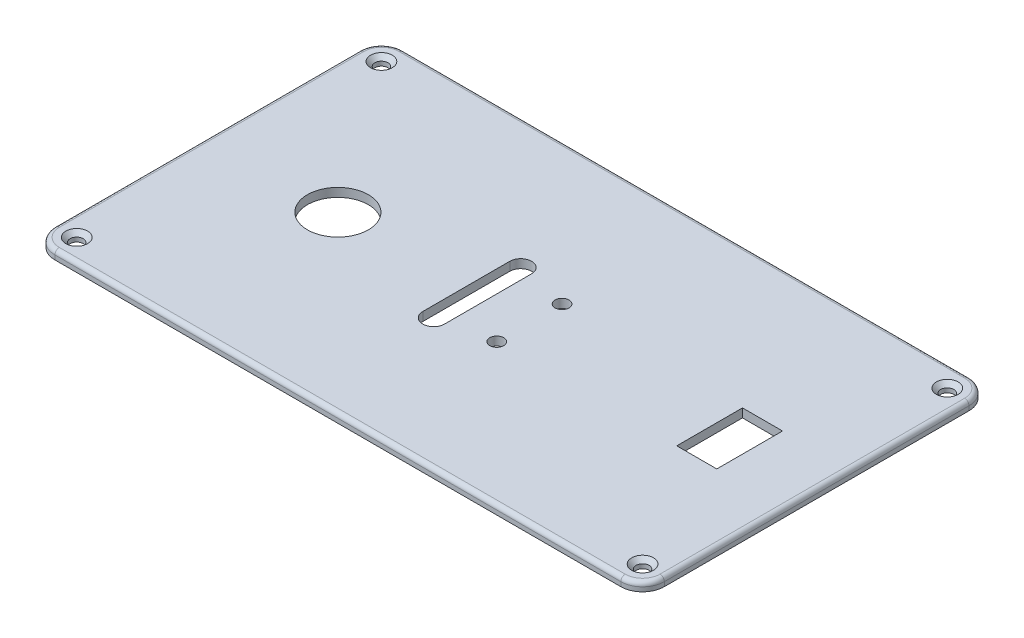
ISO-10303-21;
HEADER;
FILE_DESCRIPTION(('STEP AP214'),'2;1');
FILE_NAME('part.step','',(''),(''),'','','');
FILE_SCHEMA(('AUTOMOTIVE_DESIGN { 1 0 10303 214 1 1 1 1 }'));
ENDSEC;
DATA;
#1=APPLICATION_CONTEXT('core data for automotive mechanical design processes');
#2=APPLICATION_PROTOCOL_DEFINITION('international standard','automotive_design',2000,#1);
#3=PRODUCT_CONTEXT('',#1,'mechanical');
#4=PRODUCT('Part','Part','',(#3));
#5=PRODUCT_RELATED_PRODUCT_CATEGORY('part','',(#4));
#6=PRODUCT_DEFINITION_FORMATION('','',#4);
#7=PRODUCT_DEFINITION_CONTEXT('part definition',#1,'design');
#8=PRODUCT_DEFINITION('design','',#6,#7);
#9=PRODUCT_DEFINITION_SHAPE('','',#8);
#10=(LENGTH_UNIT() NAMED_UNIT(*) SI_UNIT(.MILLI.,.METRE.));
#11=(NAMED_UNIT(*) PLANE_ANGLE_UNIT() SI_UNIT($,.RADIAN.));
#12=(NAMED_UNIT(*) SI_UNIT($,.STERADIAN.) SOLID_ANGLE_UNIT());
#13=UNCERTAINTY_MEASURE_WITH_UNIT(LENGTH_MEASURE(1.E-05),#10,'distance_accuracy_value','');
#14=(GEOMETRIC_REPRESENTATION_CONTEXT(3) GLOBAL_UNCERTAINTY_ASSIGNED_CONTEXT((#13)) GLOBAL_UNIT_ASSIGNED_CONTEXT((#10,
#11,#12)) REPRESENTATION_CONTEXT('',''));
#15=CARTESIAN_POINT('',(0.,0.,0.));
#16=DIRECTION('',(0.,0.,1.));
#17=DIRECTION('',(1.,0.,0.));
#18=AXIS2_PLACEMENT_3D('',#15,#16,#17);
#19=CARTESIAN_POINT('',(-65.,2.,35.));
#20=DIRECTION('',(0.,-1.,0.));
#21=DIRECTION('',(0.,0.,-1.));
#22=AXIS2_PLACEMENT_3D('',#19,#20,#21);
#23=CYLINDRICAL_SURFACE('',#22,5.);
#24=DIRECTION('',(0.,-1.,0.));
#25=VECTOR('',#24,1.);
#26=CARTESIAN_POINT('',(-65.,2.,40.));
#27=LINE('',#26,#25);
#28=CARTESIAN_POINT('',(-65.,1.,40.));
#29=VERTEX_POINT('',#28);
#30=CARTESIAN_POINT('',(-65.,0.,40.));
#31=VERTEX_POINT('',#30);
#32=EDGE_CURVE('E326',#29,#31,#27,.T.);
#33=ORIENTED_EDGE('',*,*,#32,.F.);
#34=CARTESIAN_POINT('',(-65.,1.,35.));
#35=DIRECTION('',(0.,-1.,0.));
#36=DIRECTION('',(0.,0.,-1.));
#37=AXIS2_PLACEMENT_3D('',#34,#35,#36);
#38=CIRCLE('',#37,5.);
#39=CARTESIAN_POINT('',(-70.,1.,35.));
#40=VERTEX_POINT('',#39);
#41=EDGE_CURVE('E374',#29,#40,#38,.T.);
#42=ORIENTED_EDGE('',*,*,#41,.T.);
#43=DIRECTION('',(0.,-1.,0.));
#44=VECTOR('',#43,1.);
#45=CARTESIAN_POINT('',(-70.,2.,35.));
#46=LINE('',#45,#44);
#47=CARTESIAN_POINT('',(-70.,0.,35.));
#48=VERTEX_POINT('',#47);
#49=EDGE_CURVE('E312',#40,#48,#46,.T.);
#50=ORIENTED_EDGE('',*,*,#49,.T.);
#51=CARTESIAN_POINT('',(-65.,0.,35.));
#52=DIRECTION('',(0.,1.,0.));
#53=DIRECTION('',(0.,0.,-1.));
#54=AXIS2_PLACEMENT_3D('',#51,#52,#53);
#55=CIRCLE('',#54,5.);
#56=EDGE_CURVE('E288',#48,#31,#55,.T.);
#57=ORIENTED_EDGE('',*,*,#56,.T.);
#58=EDGE_LOOP('',(#33,#42,#50,#57));
#59=FACE_BOUND('',#58,.T.);
#60=ADVANCED_FACE('F45',(#59),#23,.T.);
#61=CARTESIAN_POINT('',(-65.,2.,40.));
#62=DIRECTION('',(0.,0.,-1.));
#63=DIRECTION('',(-1.,0.,0.));
#64=AXIS2_PLACEMENT_3D('',#61,#62,#63);
#65=PLANE('',#64);
#66=DIRECTION('',(0.,-1.,0.));
#67=VECTOR('',#66,1.);
#68=CARTESIAN_POINT('',(65.,2.,40.));
#69=LINE('',#68,#67);
#70=CARTESIAN_POINT('',(65.,1.,40.));
#71=VERTEX_POINT('',#70);
#72=CARTESIAN_POINT('',(65.,0.,40.));
#73=VERTEX_POINT('',#72);
#74=EDGE_CURVE('E324',#71,#73,#69,.T.);
#75=ORIENTED_EDGE('',*,*,#74,.F.);
#76=DIRECTION('',(1.,0.,0.));
#77=VECTOR('',#76,1.);
#78=CARTESIAN_POINT('',(-65.,1.,40.));
#79=LINE('',#78,#77);
#80=EDGE_CURVE('E372',#71,#29,#79,.F.);
#81=ORIENTED_EDGE('',*,*,#80,.T.);
#82=ORIENTED_EDGE('',*,*,#32,.T.);
#83=DIRECTION('',(1.,0.,0.));
#84=VECTOR('',#83,1.);
#85=CARTESIAN_POINT('',(-65.,0.,40.));
#86=LINE('',#85,#84);
#87=EDGE_CURVE('E291',#31,#73,#86,.T.);
#88=ORIENTED_EDGE('',*,*,#87,.T.);
#89=EDGE_LOOP('',(#75,#81,#82,#88));
#90=FACE_BOUND('',#89,.T.);
#91=ADVANCED_FACE('F472',(#90),#65,.F.);
#92=CARTESIAN_POINT('',(65.,2.,35.));
#93=DIRECTION('',(0.,-1.,0.));
#94=DIRECTION('',(0.,0.,-1.));
#95=AXIS2_PLACEMENT_3D('',#92,#93,#94);
#96=CYLINDRICAL_SURFACE('',#95,5.);
#97=DIRECTION('',(0.,-1.,0.));
#98=VECTOR('',#97,1.);
#99=CARTESIAN_POINT('',(70.,2.,35.));
#100=LINE('',#99,#98);
#101=CARTESIAN_POINT('',(70.,1.,35.));
#102=VERTEX_POINT('',#101);
#103=CARTESIAN_POINT('',(70.,0.,35.));
#104=VERTEX_POINT('',#103);
#105=EDGE_CURVE('E322',#102,#104,#100,.T.);
#106=ORIENTED_EDGE('',*,*,#105,.F.);
#107=CARTESIAN_POINT('',(65.,1.,35.));
#108=DIRECTION('',(0.,-1.,0.));
#109=DIRECTION('',(0.,0.,-1.));
#110=AXIS2_PLACEMENT_3D('',#107,#108,#109);
#111=CIRCLE('',#110,5.);
#112=EDGE_CURVE('E369',#102,#71,#111,.T.);
#113=ORIENTED_EDGE('',*,*,#112,.T.);
#114=ORIENTED_EDGE('',*,*,#74,.T.);
#115=CARTESIAN_POINT('',(65.,0.,35.));
#116=DIRECTION('',(0.,1.,0.));
#117=DIRECTION('',(0.,0.,1.));
#118=AXIS2_PLACEMENT_3D('',#115,#116,#117);
#119=CIRCLE('',#118,5.);
#120=EDGE_CURVE('E294',#73,#104,#119,.T.);
#121=ORIENTED_EDGE('',*,*,#120,.T.);
#122=EDGE_LOOP('',(#106,#113,#114,#121));
#123=FACE_BOUND('',#122,.T.);
#124=ADVANCED_FACE('F458',(#123),#96,.T.);
#125=CARTESIAN_POINT('',(70.,2.,35.));
#126=DIRECTION('',(-1.,0.,0.));
#127=DIRECTION('',(0.,0.,1.));
#128=AXIS2_PLACEMENT_3D('',#125,#126,#127);
#129=PLANE('',#128);
#130=DIRECTION('',(0.,-1.,0.));
#131=VECTOR('',#130,1.);
#132=CARTESIAN_POINT('',(70.,2.,-35.));
#133=LINE('',#132,#131);
#134=CARTESIAN_POINT('',(70.,1.,-35.));
#135=VERTEX_POINT('',#134);
#136=CARTESIAN_POINT('',(70.,0.,-35.));
#137=VERTEX_POINT('',#136);
#138=EDGE_CURVE('E320',#135,#137,#133,.T.);
#139=ORIENTED_EDGE('',*,*,#138,.F.);
#140=DIRECTION('',(0.,0.,-1.));
#141=VECTOR('',#140,1.);
#142=CARTESIAN_POINT('',(70.,1.,35.));
#143=LINE('',#142,#141);
#144=EDGE_CURVE('E11',#135,#102,#143,.F.);
#145=ORIENTED_EDGE('',*,*,#144,.T.);
#146=ORIENTED_EDGE('',*,*,#105,.T.);
#147=DIRECTION('',(0.,0.,-1.));
#148=VECTOR('',#147,1.);
#149=CARTESIAN_POINT('',(70.,0.,35.));
#150=LINE('',#149,#148);
#151=EDGE_CURVE('E297',#104,#137,#150,.T.);
#152=ORIENTED_EDGE('',*,*,#151,.T.);
#153=EDGE_LOOP('',(#139,#145,#146,#152));
#154=FACE_BOUND('',#153,.T.);
#155=ADVANCED_FACE('F455',(#154),#129,.F.);
#156=CARTESIAN_POINT('',(65.,2.,-35.));
#157=DIRECTION('',(0.,-1.,0.));
#158=DIRECTION('',(0.,0.,-1.));
#159=AXIS2_PLACEMENT_3D('',#156,#157,#158);
#160=CYLINDRICAL_SURFACE('',#159,5.);
#161=DIRECTION('',(0.,-1.,0.));
#162=VECTOR('',#161,1.);
#163=CARTESIAN_POINT('',(65.,2.,-40.));
#164=LINE('',#163,#162);
#165=CARTESIAN_POINT('',(65.,1.,-40.));
#166=VERTEX_POINT('',#165);
#167=CARTESIAN_POINT('',(65.,0.,-40.));
#168=VERTEX_POINT('',#167);
#169=EDGE_CURVE('E318',#166,#168,#164,.T.);
#170=ORIENTED_EDGE('',*,*,#169,.F.);
#171=CARTESIAN_POINT('',(65.,1.,-35.));
#172=DIRECTION('',(0.,-1.,0.));
#173=DIRECTION('',(0.,0.,-1.));
#174=AXIS2_PLACEMENT_3D('',#171,#172,#173);
#175=CIRCLE('',#174,5.);
#176=EDGE_CURVE('E54',#166,#135,#175,.T.);
#177=ORIENTED_EDGE('',*,*,#176,.T.);
#178=ORIENTED_EDGE('',*,*,#138,.T.);
#179=CARTESIAN_POINT('',(65.,0.,-35.));
#180=DIRECTION('',(0.,1.,0.));
#181=DIRECTION('',(0.,0.,-1.));
#182=AXIS2_PLACEMENT_3D('',#179,#180,#181);
#183=CIRCLE('',#182,5.);
#184=EDGE_CURVE('E300',#137,#168,#183,.T.);
#185=ORIENTED_EDGE('',*,*,#184,.T.);
#186=EDGE_LOOP('',(#170,#177,#178,#185));
#187=FACE_BOUND('',#186,.T.);
#188=ADVANCED_FACE('F554',(#187),#160,.T.);
#189=CARTESIAN_POINT('',(-65.,2.,-40.));
#190=DIRECTION('',(0.,0.,1.));
#191=DIRECTION('',(1.,0.,0.));
#192=AXIS2_PLACEMENT_3D('',#189,#190,#191);
#193=PLANE('',#192);
#194=DIRECTION('',(0.,-1.,0.));
#195=VECTOR('',#194,1.);
#196=CARTESIAN_POINT('',(-65.,2.,-40.));
#197=LINE('',#196,#195);
#198=CARTESIAN_POINT('',(-65.,1.,-40.));
#199=VERTEX_POINT('',#198);
#200=CARTESIAN_POINT('',(-65.,0.,-40.));
#201=VERTEX_POINT('',#200);
#202=EDGE_CURVE('E316',#199,#201,#197,.T.);
#203=ORIENTED_EDGE('',*,*,#202,.F.);
#204=DIRECTION('',(-1.,0.,0.));
#205=VECTOR('',#204,1.);
#206=CARTESIAN_POINT('',(-65.,1.,-40.));
#207=LINE('',#206,#205);
#208=EDGE_CURVE('E69',#199,#166,#207,.F.);
#209=ORIENTED_EDGE('',*,*,#208,.T.);
#210=ORIENTED_EDGE('',*,*,#169,.T.);
#211=DIRECTION('',(-1.,0.,0.));
#212=VECTOR('',#211,1.);
#213=CARTESIAN_POINT('',(-65.,0.,-40.));
#214=LINE('',#213,#212);
#215=EDGE_CURVE('E303',#168,#201,#214,.T.);
#216=ORIENTED_EDGE('',*,*,#215,.T.);
#217=EDGE_LOOP('',(#203,#209,#210,#216));
#218=FACE_BOUND('',#217,.T.);
#219=ADVANCED_FACE('F415',(#218),#193,.F.);
#220=CARTESIAN_POINT('',(-65.,2.,-35.));
#221=DIRECTION('',(0.,-1.,0.));
#222=DIRECTION('',(0.,0.,-1.));
#223=AXIS2_PLACEMENT_3D('',#220,#221,#222);
#224=CYLINDRICAL_SURFACE('',#223,5.);
#225=DIRECTION('',(0.,-1.,0.));
#226=VECTOR('',#225,1.);
#227=CARTESIAN_POINT('',(-70.,2.,-35.));
#228=LINE('',#227,#226);
#229=CARTESIAN_POINT('',(-70.,1.,-35.));
#230=VERTEX_POINT('',#229);
#231=CARTESIAN_POINT('',(-70.,0.,-35.));
#232=VERTEX_POINT('',#231);
#233=EDGE_CURVE('E314',#230,#232,#228,.T.);
#234=ORIENTED_EDGE('',*,*,#233,.F.);
#235=CARTESIAN_POINT('',(-65.,1.,-35.));
#236=DIRECTION('',(0.,-1.,0.));
#237=DIRECTION('',(0.,0.,-1.));
#238=AXIS2_PLACEMENT_3D('',#235,#236,#237);
#239=CIRCLE('',#238,5.);
#240=EDGE_CURVE('E378',#230,#199,#239,.T.);
#241=ORIENTED_EDGE('',*,*,#240,.T.);
#242=ORIENTED_EDGE('',*,*,#202,.T.);
#243=CARTESIAN_POINT('',(-65.,0.,-35.));
#244=DIRECTION('',(0.,1.,0.));
#245=DIRECTION('',(0.,0.,-1.));
#246=AXIS2_PLACEMENT_3D('',#243,#244,#245);
#247=CIRCLE('',#246,5.);
#248=EDGE_CURVE('E306',#201,#232,#247,.T.);
#249=ORIENTED_EDGE('',*,*,#248,.T.);
#250=EDGE_LOOP('',(#234,#241,#242,#249));
#251=FACE_BOUND('',#250,.T.);
#252=ADVANCED_FACE('F414',(#251),#224,.T.);
#253=CARTESIAN_POINT('',(-70.,2.,35.));
#254=DIRECTION('',(1.,0.,0.));
#255=DIRECTION('',(0.,0.,-1.));
#256=AXIS2_PLACEMENT_3D('',#253,#254,#255);
#257=PLANE('',#256);
#258=ORIENTED_EDGE('',*,*,#49,.F.);
#259=DIRECTION('',(0.,0.,1.));
#260=VECTOR('',#259,1.);
#261=CARTESIAN_POINT('',(-70.,1.,35.));
#262=LINE('',#261,#260);
#263=EDGE_CURVE('E376',#40,#230,#262,.F.);
#264=ORIENTED_EDGE('',*,*,#263,.T.);
#265=ORIENTED_EDGE('',*,*,#233,.T.);
#266=DIRECTION('',(0.,0.,1.));
#267=VECTOR('',#266,1.);
#268=CARTESIAN_POINT('',(-70.,0.,35.));
#269=LINE('',#268,#267);
#270=EDGE_CURVE('E309',#232,#48,#269,.T.);
#271=ORIENTED_EDGE('',*,*,#270,.T.);
#272=EDGE_LOOP('',(#258,#264,#265,#271));
#273=FACE_BOUND('',#272,.T.);
#274=ADVANCED_FACE('F425',(#273),#257,.F.);
#275=CARTESIAN_POINT('',(-65.,2.,35.));
#276=DIRECTION('',(0.,-1.,0.));
#277=DIRECTION('',(0.,0.,-1.));
#278=AXIS2_PLACEMENT_3D('',#275,#276,#277);
#279=PLANE('',#278);
#280=DIRECTION('',(1.,0.,0.));
#281=VECTOR('',#280,1.);
#282=CARTESIAN_POINT('',(-65.,2.,39.));
#283=LINE('',#282,#281);
#284=CARTESIAN_POINT('',(-65.,2.,39.));
#285=VERTEX_POINT('',#284);
#286=CARTESIAN_POINT('',(65.,2.,39.));
#287=VERTEX_POINT('',#286);
#288=EDGE_CURVE('E364',#285,#287,#283,.T.);
#289=ORIENTED_EDGE('',*,*,#288,.T.);
#290=CARTESIAN_POINT('',(65.,2.,35.));
#291=DIRECTION('',(0.,-1.,0.));
#292=DIRECTION('',(0.,0.,-1.));
#293=AXIS2_PLACEMENT_3D('',#290,#291,#292);
#294=CIRCLE('',#293,4.);
#295=CARTESIAN_POINT('',(69.,2.,35.));
#296=VERTEX_POINT('',#295);
#297=EDGE_CURVE('E366',#287,#296,#294,.F.);
#298=ORIENTED_EDGE('',*,*,#297,.T.);
#299=DIRECTION('',(0.,0.,-1.));
#300=VECTOR('',#299,1.);
#301=CARTESIAN_POINT('',(69.,2.,35.));
#302=LINE('',#301,#300);
#303=CARTESIAN_POINT('',(69.,2.,-35.));
#304=VERTEX_POINT('',#303);
#305=EDGE_CURVE('E352',#296,#304,#302,.T.);
#306=ORIENTED_EDGE('',*,*,#305,.T.);
#307=CARTESIAN_POINT('',(65.,2.,-35.));
#308=DIRECTION('',(0.,-1.,0.));
#309=DIRECTION('',(0.,0.,-1.));
#310=AXIS2_PLACEMENT_3D('',#307,#308,#309);
#311=CIRCLE('',#310,4.);
#312=CARTESIAN_POINT('',(65.,2.,-39.));
#313=VERTEX_POINT('',#312);
#314=EDGE_CURVE('E354',#304,#313,#311,.F.);
#315=ORIENTED_EDGE('',*,*,#314,.T.);
#316=DIRECTION('',(-1.,0.,0.));
#317=VECTOR('',#316,1.);
#318=CARTESIAN_POINT('',(-65.,2.,-39.));
#319=LINE('',#318,#317);
#320=CARTESIAN_POINT('',(-65.,2.,-39.));
#321=VERTEX_POINT('',#320);
#322=EDGE_CURVE('E356',#313,#321,#319,.T.);
#323=ORIENTED_EDGE('',*,*,#322,.T.);
#324=CARTESIAN_POINT('',(-65.,2.,-35.));
#325=DIRECTION('',(0.,-1.,0.));
#326=DIRECTION('',(0.,0.,-1.));
#327=AXIS2_PLACEMENT_3D('',#324,#325,#326);
#328=CIRCLE('',#327,4.);
#329=CARTESIAN_POINT('',(-69.,2.,-35.));
#330=VERTEX_POINT('',#329);
#331=EDGE_CURVE('E358',#321,#330,#328,.F.);
#332=ORIENTED_EDGE('',*,*,#331,.T.);
#333=DIRECTION('',(0.,0.,1.));
#334=VECTOR('',#333,1.);
#335=CARTESIAN_POINT('',(-69.,2.,35.));
#336=LINE('',#335,#334);
#337=CARTESIAN_POINT('',(-69.,2.,35.));
#338=VERTEX_POINT('',#337);
#339=EDGE_CURVE('E360',#330,#338,#336,.T.);
#340=ORIENTED_EDGE('',*,*,#339,.T.);
#341=CARTESIAN_POINT('',(-65.,2.,35.));
#342=DIRECTION('',(0.,-1.,0.));
#343=DIRECTION('',(0.,0.,-1.));
#344=AXIS2_PLACEMENT_3D('',#341,#342,#343);
#345=CIRCLE('',#344,4.);
#346=EDGE_CURVE('E362',#338,#285,#345,.F.);
#347=ORIENTED_EDGE('',*,*,#346,.T.);
#348=EDGE_LOOP('',(#289,#298,#306,#315,#323,#332,#340,#347));
#349=FACE_BOUND('',#348,.T.);
#350=DIRECTION('',(-1.,0.,0.));
#351=VECTOR('',#350,1.);
#352=CARTESIAN_POINT('',(45.4,2.,-7.54999999999999));
#353=LINE('',#352,#351);
#354=CARTESIAN_POINT('',(54.6,2.,-7.54999999999999));
#355=VERTEX_POINT('',#354);
#356=CARTESIAN_POINT('',(45.4,2.,-7.54999999999999));
#357=VERTEX_POINT('',#356);
#358=EDGE_CURVE('E217',#355,#357,#353,.T.);
#359=ORIENTED_EDGE('',*,*,#358,.F.);
#360=DIRECTION('',(0.,0.,-1.));
#361=VECTOR('',#360,1.);
#362=CARTESIAN_POINT('',(54.6,2.,-7.54999999999999));
#363=LINE('',#362,#361);
#364=CARTESIAN_POINT('',(54.6,2.,7.55000000000001));
#365=VERTEX_POINT('',#364);
#366=EDGE_CURVE('E190',#365,#355,#363,.T.);
#367=ORIENTED_EDGE('',*,*,#366,.F.);
#368=DIRECTION('',(1.,0.,0.));
#369=VECTOR('',#368,1.);
#370=CARTESIAN_POINT('',(45.4,2.,7.55000000000001));
#371=LINE('',#370,#369);
#372=CARTESIAN_POINT('',(45.4,2.,7.55000000000001));
#373=VERTEX_POINT('',#372);
#374=EDGE_CURVE('E208',#373,#365,#371,.T.);
#375=ORIENTED_EDGE('',*,*,#374,.F.);
#376=DIRECTION('',(0.,0.,1.));
#377=VECTOR('',#376,1.);
#378=CARTESIAN_POINT('',(45.4,2.,-7.54999999999999));
#379=LINE('',#378,#377);
#380=EDGE_CURVE('E211',#357,#373,#379,.T.);
#381=ORIENTED_EDGE('',*,*,#380,.F.);
#382=EDGE_LOOP('',(#359,#367,#375,#381));
#383=FACE_BOUND('',#382,.T.);
#384=CARTESIAN_POINT('',(-40.,2.,0.));
#385=DIRECTION('',(0.,1.,0.));
#386=DIRECTION('',(0.,0.,1.));
#387=AXIS2_PLACEMENT_3D('',#384,#385,#386);
#388=CIRCLE('',#387,7.);
#389=CARTESIAN_POINT('',(-40.,2.,7.00000000000001));
#390=VERTEX_POINT('',#389);
#391=EDGE_CURVE('E230',#390,#390,#388,.T.);
#392=ORIENTED_EDGE('',*,*,#391,.F.);
#393=EDGE_LOOP('',(#392));
#394=FACE_BOUND('',#393,.T.);
#395=DIRECTION('',(0.,0.,-1.));
#396=VECTOR('',#395,1.);
#397=CARTESIAN_POINT('',(-5.5,2.,10.));
#398=LINE('',#397,#396);
#399=CARTESIAN_POINT('',(-5.5,2.,10.));
#400=VERTEX_POINT('',#399);
#401=CARTESIAN_POINT('',(-5.5,2.,-10.));
#402=VERTEX_POINT('',#401);
#403=EDGE_CURVE('E256',#400,#402,#398,.T.);
#404=ORIENTED_EDGE('',*,*,#403,.F.);
#405=CARTESIAN_POINT('',(-8.,2.,10.));
#406=DIRECTION('',(0.,1.,0.));
#407=DIRECTION('',(0.,0.,1.));
#408=AXIS2_PLACEMENT_3D('',#405,#406,#407);
#409=CIRCLE('',#408,2.5);
#410=CARTESIAN_POINT('',(-10.5,2.,10.));
#411=VERTEX_POINT('',#410);
#412=EDGE_CURVE('E224',#411,#400,#409,.T.);
#413=ORIENTED_EDGE('',*,*,#412,.F.);
#414=DIRECTION('',(0.,0.,1.));
#415=VECTOR('',#414,1.);
#416=CARTESIAN_POINT('',(-10.5,2.,10.));
#417=LINE('',#416,#415);
#418=CARTESIAN_POINT('',(-10.5,2.,-10.));
#419=VERTEX_POINT('',#418);
#420=EDGE_CURVE('E245',#419,#411,#417,.T.);
#421=ORIENTED_EDGE('',*,*,#420,.F.);
#422=CARTESIAN_POINT('',(-8.,2.,-10.));
#423=DIRECTION('',(0.,1.,0.));
#424=DIRECTION('',(0.,0.,1.));
#425=AXIS2_PLACEMENT_3D('',#422,#423,#424);
#426=CIRCLE('',#425,2.5);
#427=EDGE_CURVE('E259',#402,#419,#426,.T.);
#428=ORIENTED_EDGE('',*,*,#427,.F.);
#429=EDGE_LOOP('',(#404,#413,#421,#428));
#430=FACE_BOUND('',#429,.T.);
#431=CARTESIAN_POINT('',(4.,2.,7.5));
#432=DIRECTION('',(0.,1.,0.));
#433=DIRECTION('',(0.,0.,1.));
#434=AXIS2_PLACEMENT_3D('',#431,#432,#433);
#435=CIRCLE('',#434,1.6);
#436=CARTESIAN_POINT('',(4.,2.,9.1));
#437=VERTEX_POINT('',#436);
#438=EDGE_CURVE('E237',#437,#437,#435,.T.);
#439=ORIENTED_EDGE('',*,*,#438,.F.);
#440=EDGE_LOOP('',(#439));
#441=FACE_BOUND('',#440,.T.);
#442=CARTESIAN_POINT('',(4.,2.,-7.5));
#443=DIRECTION('',(0.,1.,0.));
#444=DIRECTION('',(0.,0.,1.));
#445=AXIS2_PLACEMENT_3D('',#442,#443,#444);
#446=CIRCLE('',#445,1.6);
#447=CARTESIAN_POINT('',(4.,2.,-5.9));
#448=VERTEX_POINT('',#447);
#449=EDGE_CURVE('E236',#448,#448,#446,.T.);
#450=ORIENTED_EDGE('',*,*,#449,.F.);
#451=EDGE_LOOP('',(#450));
#452=FACE_BOUND('',#451,.T.);
#453=CARTESIAN_POINT('',(65.,2.,-35.));
#454=DIRECTION('',(0.,-1.,0.));
#455=DIRECTION('',(0.,0.,-1.));
#456=AXIS2_PLACEMENT_3D('',#453,#454,#455);
#457=CIRCLE('',#456,2.49999999999997);
#458=CARTESIAN_POINT('',(65.,2.,-37.5));
#459=VERTEX_POINT('',#458);
#460=EDGE_CURVE('E340',#459,#459,#457,.T.);
#461=ORIENTED_EDGE('',*,*,#460,.T.);
#462=EDGE_LOOP('',(#461));
#463=FACE_BOUND('',#462,.T.);
#464=CARTESIAN_POINT('',(65.,2.,35.));
#465=DIRECTION('',(0.,-1.,0.));
#466=DIRECTION('',(0.,0.,-1.));
#467=AXIS2_PLACEMENT_3D('',#464,#465,#466);
#468=CIRCLE('',#467,2.49999999999997);
#469=CARTESIAN_POINT('',(65.,2.,32.5));
#470=VERTEX_POINT('',#469);
#471=EDGE_CURVE('E337',#470,#470,#468,.T.);
#472=ORIENTED_EDGE('',*,*,#471,.T.);
#473=EDGE_LOOP('',(#472));
#474=FACE_BOUND('',#473,.T.);
#475=CARTESIAN_POINT('',(-65.,2.,35.));
#476=DIRECTION('',(0.,-1.,0.));
#477=DIRECTION('',(0.,0.,-1.));
#478=AXIS2_PLACEMENT_3D('',#475,#476,#477);
#479=CIRCLE('',#478,2.49999999999997);
#480=CARTESIAN_POINT('',(-65.,2.,32.5));
#481=VERTEX_POINT('',#480);
#482=EDGE_CURVE('E334',#481,#481,#479,.T.);
#483=ORIENTED_EDGE('',*,*,#482,.T.);
#484=EDGE_LOOP('',(#483));
#485=FACE_BOUND('',#484,.T.);
#486=CARTESIAN_POINT('',(-65.,2.,-35.));
#487=DIRECTION('',(0.,-1.,0.));
#488=DIRECTION('',(0.,0.,-1.));
#489=AXIS2_PLACEMENT_3D('',#486,#487,#488);
#490=CIRCLE('',#489,2.49999999999997);
#491=CARTESIAN_POINT('',(-65.,2.,-37.5));
#492=VERTEX_POINT('',#491);
#493=EDGE_CURVE('E331',#492,#492,#490,.T.);
#494=ORIENTED_EDGE('',*,*,#493,.T.);
#495=EDGE_LOOP('',(#494));
#496=FACE_BOUND('',#495,.T.);
#497=ADVANCED_FACE('F440',(#349,#383,#394,#430,#441,#452,#463,#474,#485,#496),#279,.F.);
#498=CARTESIAN_POINT('',(-65.,0.,35.));
#499=DIRECTION('',(0.,-1.,0.));
#500=DIRECTION('',(0.,0.,-1.));
#501=AXIS2_PLACEMENT_3D('',#498,#499,#500);
#502=PLANE('',#501);
#503=DIRECTION('',(0.,0.,-1.));
#504=VECTOR('',#503,1.);
#505=CARTESIAN_POINT('',(54.6,0.,-7.54999999999999));
#506=LINE('',#505,#504);
#507=CARTESIAN_POINT('',(54.6,0.,7.55000000000001));
#508=VERTEX_POINT('',#507);
#509=CARTESIAN_POINT('',(54.6,0.,-7.54999999999999));
#510=VERTEX_POINT('',#509);
#511=EDGE_CURVE('E187',#508,#510,#506,.T.);
#512=ORIENTED_EDGE('',*,*,#511,.T.);
#513=DIRECTION('',(-1.,0.,0.));
#514=VECTOR('',#513,1.);
#515=CARTESIAN_POINT('',(45.4,0.,-7.54999999999999));
#516=LINE('',#515,#514);
#517=CARTESIAN_POINT('',(45.4,0.,-7.54999999999999));
#518=VERTEX_POINT('',#517);
#519=EDGE_CURVE('E199',#510,#518,#516,.T.);
#520=ORIENTED_EDGE('',*,*,#519,.T.);
#521=DIRECTION('',(0.,0.,1.));
#522=VECTOR('',#521,1.);
#523=CARTESIAN_POINT('',(45.4,0.,-7.54999999999999));
#524=LINE('',#523,#522);
#525=CARTESIAN_POINT('',(45.4,0.,7.55000000000001));
#526=VERTEX_POINT('',#525);
#527=EDGE_CURVE('E203',#518,#526,#524,.T.);
#528=ORIENTED_EDGE('',*,*,#527,.T.);
#529=DIRECTION('',(1.,0.,0.));
#530=VECTOR('',#529,1.);
#531=CARTESIAN_POINT('',(45.4,0.,7.55000000000001));
#532=LINE('',#531,#530);
#533=EDGE_CURVE('E195',#526,#508,#532,.T.);
#534=ORIENTED_EDGE('',*,*,#533,.T.);
#535=EDGE_LOOP('',(#512,#520,#528,#534));
#536=FACE_BOUND('',#535,.T.);
#537=CARTESIAN_POINT('',(-40.,0.,0.));
#538=DIRECTION('',(0.,1.,0.));
#539=DIRECTION('',(0.,0.,1.));
#540=AXIS2_PLACEMENT_3D('',#537,#538,#539);
#541=CIRCLE('',#540,7.);
#542=CARTESIAN_POINT('',(-40.,0.,7.00000000000001));
#543=VERTEX_POINT('',#542);
#544=EDGE_CURVE('E218',#543,#543,#541,.T.);
#545=ORIENTED_EDGE('',*,*,#544,.T.);
#546=EDGE_LOOP('',(#545));
#547=FACE_BOUND('',#546,.T.);
#548=CARTESIAN_POINT('',(-8.,0.,10.));
#549=DIRECTION('',(0.,1.,0.));
#550=DIRECTION('',(0.,0.,1.));
#551=AXIS2_PLACEMENT_3D('',#548,#549,#550);
#552=CIRCLE('',#551,2.5);
#553=CARTESIAN_POINT('',(-10.5,0.,10.));
#554=VERTEX_POINT('',#553);
#555=CARTESIAN_POINT('',(-5.5,0.,10.));
#556=VERTEX_POINT('',#555);
#557=EDGE_CURVE('E241',#554,#556,#552,.T.);
#558=ORIENTED_EDGE('',*,*,#557,.T.);
#559=DIRECTION('',(0.,0.,-1.));
#560=VECTOR('',#559,1.);
#561=CARTESIAN_POINT('',(-5.5,0.,10.));
#562=LINE('',#561,#560);
#563=CARTESIAN_POINT('',(-5.5,0.,-10.));
#564=VERTEX_POINT('',#563);
#565=EDGE_CURVE('E244',#556,#564,#562,.T.);
#566=ORIENTED_EDGE('',*,*,#565,.T.);
#567=CARTESIAN_POINT('',(-8.,0.,-10.));
#568=DIRECTION('',(0.,1.,0.));
#569=DIRECTION('',(0.,0.,1.));
#570=AXIS2_PLACEMENT_3D('',#567,#568,#569);
#571=CIRCLE('',#570,2.5);
#572=CARTESIAN_POINT('',(-10.5,0.,-10.));
#573=VERTEX_POINT('',#572);
#574=EDGE_CURVE('E248',#564,#573,#571,.T.);
#575=ORIENTED_EDGE('',*,*,#574,.T.);
#576=DIRECTION('',(0.,0.,1.));
#577=VECTOR('',#576,1.);
#578=CARTESIAN_POINT('',(-10.5,0.,10.));
#579=LINE('',#578,#577);
#580=EDGE_CURVE('E251',#573,#554,#579,.T.);
#581=ORIENTED_EDGE('',*,*,#580,.T.);
#582=EDGE_LOOP('',(#558,#566,#575,#581));
#583=FACE_BOUND('',#582,.T.);
#584=CARTESIAN_POINT('',(4.,0.,7.5));
#585=DIRECTION('',(0.,1.,0.));
#586=DIRECTION('',(0.,0.,1.));
#587=AXIS2_PLACEMENT_3D('',#584,#585,#586);
#588=CIRCLE('',#587,1.6);
#589=CARTESIAN_POINT('',(4.,0.,9.1));
#590=VERTEX_POINT('',#589);
#591=EDGE_CURVE('E233',#590,#590,#588,.T.);
#592=ORIENTED_EDGE('',*,*,#591,.T.);
#593=EDGE_LOOP('',(#592));
#594=FACE_BOUND('',#593,.T.);
#595=CARTESIAN_POINT('',(4.,0.,-7.5));
#596=DIRECTION('',(0.,1.,0.));
#597=DIRECTION('',(0.,0.,1.));
#598=AXIS2_PLACEMENT_3D('',#595,#596,#597);
#599=CIRCLE('',#598,1.6);
#600=CARTESIAN_POINT('',(4.,0.,-5.9));
#601=VERTEX_POINT('',#600);
#602=EDGE_CURVE('E271',#601,#601,#599,.T.);
#603=ORIENTED_EDGE('',*,*,#602,.T.);
#604=EDGE_LOOP('',(#603));
#605=FACE_BOUND('',#604,.T.);
#606=CARTESIAN_POINT('',(-65.,0.,-35.));
#607=DIRECTION('',(0.,1.,0.));
#608=DIRECTION('',(0.,0.,-1.));
#609=AXIS2_PLACEMENT_3D('',#606,#607,#608);
#610=CIRCLE('',#609,1.5);
#611=CARTESIAN_POINT('',(-65.,0.,-36.5));
#612=VERTEX_POINT('',#611);
#613=EDGE_CURVE('E274',#612,#612,#610,.T.);
#614=ORIENTED_EDGE('',*,*,#613,.T.);
#615=EDGE_LOOP('',(#614));
#616=FACE_BOUND('',#615,.T.);
#617=CARTESIAN_POINT('',(-65.,0.,35.));
#618=DIRECTION('',(0.,1.,0.));
#619=DIRECTION('',(0.,0.,1.));
#620=AXIS2_PLACEMENT_3D('',#617,#618,#619);
#621=CIRCLE('',#620,1.5);
#622=CARTESIAN_POINT('',(-65.,0.,36.5));
#623=VERTEX_POINT('',#622);
#624=EDGE_CURVE('E281',#623,#623,#621,.T.);
#625=ORIENTED_EDGE('',*,*,#624,.T.);
#626=EDGE_LOOP('',(#625));
#627=FACE_BOUND('',#626,.T.);
#628=CARTESIAN_POINT('',(65.,0.,35.));
#629=DIRECTION('',(0.,1.,0.));
#630=DIRECTION('',(0.,0.,-1.));
#631=AXIS2_PLACEMENT_3D('',#628,#629,#630);
#632=CIRCLE('',#631,1.5);
#633=CARTESIAN_POINT('',(65.,0.,33.5));
#634=VERTEX_POINT('',#633);
#635=EDGE_CURVE('E277',#634,#634,#632,.T.);
#636=ORIENTED_EDGE('',*,*,#635,.T.);
#637=EDGE_LOOP('',(#636));
#638=FACE_BOUND('',#637,.T.);
#639=CARTESIAN_POINT('',(65.,0.,-35.));
#640=DIRECTION('',(0.,1.,0.));
#641=DIRECTION('',(0.,0.,1.));
#642=AXIS2_PLACEMENT_3D('',#639,#640,#641);
#643=CIRCLE('',#642,1.5);
#644=CARTESIAN_POINT('',(65.,0.,-33.5));
#645=VERTEX_POINT('',#644);
#646=EDGE_CURVE('E280',#645,#645,#643,.T.);
#647=ORIENTED_EDGE('',*,*,#646,.T.);
#648=EDGE_LOOP('',(#647));
#649=FACE_BOUND('',#648,.T.);
#650=ORIENTED_EDGE('',*,*,#56,.F.);
#651=ORIENTED_EDGE('',*,*,#270,.F.);
#652=ORIENTED_EDGE('',*,*,#248,.F.);
#653=ORIENTED_EDGE('',*,*,#215,.F.);
#654=ORIENTED_EDGE('',*,*,#184,.F.);
#655=ORIENTED_EDGE('',*,*,#151,.F.);
#656=ORIENTED_EDGE('',*,*,#120,.F.);
#657=ORIENTED_EDGE('',*,*,#87,.F.);
#658=EDGE_LOOP('',(#650,#651,#652,#653,#654,#655,#656,#657));
#659=FACE_BOUND('',#658,.T.);
#660=ADVANCED_FACE('F205',(#536,#547,#583,#594,#605,#616,#627,#638,#649,#659),#502,.T.);
#661=CARTESIAN_POINT('',(65.,0.,-35.));
#662=DIRECTION('',(0.,1.,0.));
#663=DIRECTION('',(0.,0.,1.));
#664=AXIS2_PLACEMENT_3D('',#661,#662,#663);
#665=CYLINDRICAL_SURFACE('',#664,1.5);
#666=CARTESIAN_POINT('',(65.,1.00000000000003,-35.));
#667=DIRECTION('',(0.,-1.,0.));
#668=DIRECTION('',(0.,0.,-1.));
#669=AXIS2_PLACEMENT_3D('',#666,#667,#668);
#670=CIRCLE('',#669,1.5);
#671=CARTESIAN_POINT('',(65.,1.00000000000003,-36.5));
#672=VERTEX_POINT('',#671);
#673=EDGE_CURVE('E328',#672,#672,#670,.F.);
#674=ORIENTED_EDGE('',*,*,#673,.T.);
#675=EDGE_LOOP('',(#674));
#676=FACE_BOUND('',#675,.T.);
#677=ORIENTED_EDGE('',*,*,#646,.F.);
#678=EDGE_LOOP('',(#677));
#679=FACE_BOUND('',#678,.T.);
#680=ADVANCED_FACE('F527',(#676,#679),#665,.F.);
#681=CARTESIAN_POINT('',(65.,0.,35.));
#682=DIRECTION('',(0.,1.,0.));
#683=DIRECTION('',(0.,0.,1.));
#684=AXIS2_PLACEMENT_3D('',#681,#682,#683);
#685=CYLINDRICAL_SURFACE('',#684,1.5);
#686=CARTESIAN_POINT('',(65.,1.00000000000003,35.));
#687=DIRECTION('',(0.,-1.,0.));
#688=DIRECTION('',(0.,0.,-1.));
#689=AXIS2_PLACEMENT_3D('',#686,#687,#688);
#690=CIRCLE('',#689,1.5);
#691=CARTESIAN_POINT('',(65.,1.00000000000003,33.5));
#692=VERTEX_POINT('',#691);
#693=EDGE_CURVE('E343',#692,#692,#690,.F.);
#694=ORIENTED_EDGE('',*,*,#693,.T.);
#695=EDGE_LOOP('',(#694));
#696=FACE_BOUND('',#695,.T.);
#697=ORIENTED_EDGE('',*,*,#635,.F.);
#698=EDGE_LOOP('',(#697));
#699=FACE_BOUND('',#698,.T.);
#700=ADVANCED_FACE('F536',(#696,#699),#685,.F.);
#701=CARTESIAN_POINT('',(-65.,0.,35.));
#702=DIRECTION('',(0.,1.,0.));
#703=DIRECTION('',(0.,0.,1.));
#704=AXIS2_PLACEMENT_3D('',#701,#702,#703);
#705=CYLINDRICAL_SURFACE('',#704,1.5);
#706=CARTESIAN_POINT('',(-65.,1.00000000000003,35.));
#707=DIRECTION('',(0.,-1.,0.));
#708=DIRECTION('',(0.,0.,-1.));
#709=AXIS2_PLACEMENT_3D('',#706,#707,#708);
#710=CIRCLE('',#709,1.5);
#711=CARTESIAN_POINT('',(-65.,1.00000000000003,33.5));
#712=VERTEX_POINT('',#711);
#713=EDGE_CURVE('E346',#712,#712,#710,.F.);
#714=ORIENTED_EDGE('',*,*,#713,.T.);
#715=EDGE_LOOP('',(#714));
#716=FACE_BOUND('',#715,.T.);
#717=ORIENTED_EDGE('',*,*,#624,.F.);
#718=EDGE_LOOP('',(#717));
#719=FACE_BOUND('',#718,.T.);
#720=ADVANCED_FACE('F521',(#716,#719),#705,.F.);
#721=CARTESIAN_POINT('',(-65.,0.,-35.));
#722=DIRECTION('',(0.,1.,0.));
#723=DIRECTION('',(0.,0.,1.));
#724=AXIS2_PLACEMENT_3D('',#721,#722,#723);
#725=CYLINDRICAL_SURFACE('',#724,1.5);
#726=CARTESIAN_POINT('',(-65.,1.00000000000003,-35.));
#727=DIRECTION('',(0.,-1.,0.));
#728=DIRECTION('',(0.,0.,-1.));
#729=AXIS2_PLACEMENT_3D('',#726,#727,#728);
#730=CIRCLE('',#729,1.5);
#731=CARTESIAN_POINT('',(-65.,1.00000000000003,-36.5));
#732=VERTEX_POINT('',#731);
#733=EDGE_CURVE('E349',#732,#732,#730,.F.);
#734=ORIENTED_EDGE('',*,*,#733,.T.);
#735=EDGE_LOOP('',(#734));
#736=FACE_BOUND('',#735,.T.);
#737=ORIENTED_EDGE('',*,*,#613,.F.);
#738=EDGE_LOOP('',(#737));
#739=FACE_BOUND('',#738,.T.);
#740=ADVANCED_FACE('F489',(#736,#739),#725,.F.);
#741=CARTESIAN_POINT('',(65.,1.00000000000003,-35.));
#742=DIRECTION('',(0.,1.,0.));
#743=DIRECTION('',(0.,0.,1.));
#744=AXIS2_PLACEMENT_3D('',#741,#742,#743);
#745=CONICAL_SURFACE('',#744,1.5,0.785398163397452);
#746=ORIENTED_EDGE('',*,*,#460,.F.);
#747=EDGE_LOOP('',(#746));
#748=FACE_BOUND('',#747,.T.);
#749=ORIENTED_EDGE('',*,*,#673,.F.);
#750=EDGE_LOOP('',(#749));
#751=FACE_BOUND('',#750,.T.);
#752=ADVANCED_FACE('F482',(#748,#751),#745,.F.);
#753=CARTESIAN_POINT('',(65.,1.00000000000003,35.));
#754=DIRECTION('',(0.,1.,0.));
#755=DIRECTION('',(0.,0.,1.));
#756=AXIS2_PLACEMENT_3D('',#753,#754,#755);
#757=CONICAL_SURFACE('',#756,1.5,0.785398163397452);
#758=ORIENTED_EDGE('',*,*,#471,.F.);
#759=EDGE_LOOP('',(#758));
#760=FACE_BOUND('',#759,.T.);
#761=ORIENTED_EDGE('',*,*,#693,.F.);
#762=EDGE_LOOP('',(#761));
#763=FACE_BOUND('',#762,.T.);
#764=ADVANCED_FACE('F488',(#760,#763),#757,.F.);
#765=CARTESIAN_POINT('',(-65.,1.00000000000003,35.));
#766=DIRECTION('',(0.,1.,0.));
#767=DIRECTION('',(0.,0.,1.));
#768=AXIS2_PLACEMENT_3D('',#765,#766,#767);
#769=CONICAL_SURFACE('',#768,1.5,0.785398163397452);
#770=ORIENTED_EDGE('',*,*,#482,.F.);
#771=EDGE_LOOP('',(#770));
#772=FACE_BOUND('',#771,.T.);
#773=ORIENTED_EDGE('',*,*,#713,.F.);
#774=EDGE_LOOP('',(#773));
#775=FACE_BOUND('',#774,.T.);
#776=ADVANCED_FACE('F496',(#772,#775),#769,.F.);
#777=CARTESIAN_POINT('',(-65.,1.00000000000003,-35.));
#778=DIRECTION('',(0.,1.,0.));
#779=DIRECTION('',(0.,0.,1.));
#780=AXIS2_PLACEMENT_3D('',#777,#778,#779);
#781=CONICAL_SURFACE('',#780,1.5,0.785398163397452);
#782=ORIENTED_EDGE('',*,*,#493,.F.);
#783=EDGE_LOOP('',(#782));
#784=FACE_BOUND('',#783,.T.);
#785=ORIENTED_EDGE('',*,*,#733,.F.);
#786=EDGE_LOOP('',(#785));
#787=FACE_BOUND('',#786,.T.);
#788=ADVANCED_FACE('F502',(#784,#787),#781,.F.);
#789=CARTESIAN_POINT('',(4.,0.,-7.5));
#790=DIRECTION('',(0.,1.,0.));
#791=DIRECTION('',(0.,0.,1.));
#792=AXIS2_PLACEMENT_3D('',#789,#790,#791);
#793=CYLINDRICAL_SURFACE('',#792,1.6);
#794=ORIENTED_EDGE('',*,*,#602,.F.);
#795=EDGE_LOOP('',(#794));
#796=FACE_BOUND('',#795,.T.);
#797=ORIENTED_EDGE('',*,*,#449,.T.);
#798=EDGE_LOOP('',(#797));
#799=FACE_BOUND('',#798,.T.);
#800=ADVANCED_FACE('F507',(#796,#799),#793,.F.);
#801=CARTESIAN_POINT('',(4.,0.,7.5));
#802=DIRECTION('',(0.,1.,0.));
#803=DIRECTION('',(0.,0.,1.));
#804=AXIS2_PLACEMENT_3D('',#801,#802,#803);
#805=CYLINDRICAL_SURFACE('',#804,1.6);
#806=ORIENTED_EDGE('',*,*,#591,.F.);
#807=EDGE_LOOP('',(#806));
#808=FACE_BOUND('',#807,.T.);
#809=ORIENTED_EDGE('',*,*,#438,.T.);
#810=EDGE_LOOP('',(#809));
#811=FACE_BOUND('',#810,.T.);
#812=ADVANCED_FACE('F512',(#808,#811),#805,.F.);
#813=CARTESIAN_POINT('',(-8.,0.,10.));
#814=DIRECTION('',(0.,1.,0.));
#815=DIRECTION('',(0.,0.,1.));
#816=AXIS2_PLACEMENT_3D('',#813,#814,#815);
#817=CYLINDRICAL_SURFACE('',#816,2.5);
#818=ORIENTED_EDGE('',*,*,#412,.T.);
#819=DIRECTION('',(0.,1.,0.));
#820=VECTOR('',#819,1.);
#821=CARTESIAN_POINT('',(-5.5,0.,10.));
#822=LINE('',#821,#820);
#823=EDGE_CURVE('E254',#556,#400,#822,.T.);
#824=ORIENTED_EDGE('',*,*,#823,.F.);
#825=ORIENTED_EDGE('',*,*,#557,.F.);
#826=DIRECTION('',(0.,1.,0.));
#827=VECTOR('',#826,1.);
#828=CARTESIAN_POINT('',(-10.5,0.,10.));
#829=LINE('',#828,#827);
#830=EDGE_CURVE('E240',#554,#411,#829,.T.);
#831=ORIENTED_EDGE('',*,*,#830,.T.);
#832=EDGE_LOOP('',(#818,#824,#825,#831));
#833=FACE_BOUND('',#832,.T.);
#834=ADVANCED_FACE('F729',(#833),#817,.F.);
#835=CARTESIAN_POINT('',(-10.5,0.,10.));
#836=DIRECTION('',(-1.,0.,0.));
#837=DIRECTION('',(0.,0.,1.));
#838=AXIS2_PLACEMENT_3D('',#835,#836,#837);
#839=PLANE('',#838);
#840=ORIENTED_EDGE('',*,*,#420,.T.);
#841=ORIENTED_EDGE('',*,*,#830,.F.);
#842=ORIENTED_EDGE('',*,*,#580,.F.);
#843=DIRECTION('',(0.,1.,0.));
#844=VECTOR('',#843,1.);
#845=CARTESIAN_POINT('',(-10.5,0.,-10.));
#846=LINE('',#845,#844);
#847=EDGE_CURVE('E265',#573,#419,#846,.T.);
#848=ORIENTED_EDGE('',*,*,#847,.T.);
#849=EDGE_LOOP('',(#840,#841,#842,#848));
#850=FACE_BOUND('',#849,.T.);
#851=ADVANCED_FACE('F731',(#850),#839,.F.);
#852=CARTESIAN_POINT('',(-8.,0.,-10.));
#853=DIRECTION('',(0.,1.,0.));
#854=DIRECTION('',(0.,0.,1.));
#855=AXIS2_PLACEMENT_3D('',#852,#853,#854);
#856=CYLINDRICAL_SURFACE('',#855,2.5);
#857=ORIENTED_EDGE('',*,*,#427,.T.);
#858=ORIENTED_EDGE('',*,*,#847,.F.);
#859=ORIENTED_EDGE('',*,*,#574,.F.);
#860=DIRECTION('',(0.,1.,0.));
#861=VECTOR('',#860,1.);
#862=CARTESIAN_POINT('',(-5.5,0.,-10.));
#863=LINE('',#862,#861);
#864=EDGE_CURVE('E267',#564,#402,#863,.T.);
#865=ORIENTED_EDGE('',*,*,#864,.T.);
#866=EDGE_LOOP('',(#857,#858,#859,#865));
#867=FACE_BOUND('',#866,.T.);
#868=ADVANCED_FACE('F734',(#867),#856,.F.);
#869=CARTESIAN_POINT('',(-5.5,0.,10.));
#870=DIRECTION('',(1.,0.,0.));
#871=DIRECTION('',(0.,0.,-1.));
#872=AXIS2_PLACEMENT_3D('',#869,#870,#871);
#873=PLANE('',#872);
#874=ORIENTED_EDGE('',*,*,#403,.T.);
#875=ORIENTED_EDGE('',*,*,#864,.F.);
#876=ORIENTED_EDGE('',*,*,#565,.F.);
#877=ORIENTED_EDGE('',*,*,#823,.T.);
#878=EDGE_LOOP('',(#874,#875,#876,#877));
#879=FACE_BOUND('',#878,.T.);
#880=ADVANCED_FACE('F599',(#879),#873,.F.);
#881=CARTESIAN_POINT('',(-40.,0.,0.));
#882=DIRECTION('',(0.,1.,0.));
#883=DIRECTION('',(0.,0.,1.));
#884=AXIS2_PLACEMENT_3D('',#881,#882,#883);
#885=CYLINDRICAL_SURFACE('',#884,7.);
#886=ORIENTED_EDGE('',*,*,#544,.F.);
#887=EDGE_LOOP('',(#886));
#888=FACE_BOUND('',#887,.T.);
#889=ORIENTED_EDGE('',*,*,#391,.T.);
#890=EDGE_LOOP('',(#889));
#891=FACE_BOUND('',#890,.T.);
#892=ADVANCED_FACE('F604',(#888,#891),#885,.F.);
#893=CARTESIAN_POINT('',(54.6,0.,-7.54999999999999));
#894=DIRECTION('',(1.,0.,0.));
#895=DIRECTION('',(0.,0.,-1.));
#896=AXIS2_PLACEMENT_3D('',#893,#894,#895);
#897=PLANE('',#896);
#898=ORIENTED_EDGE('',*,*,#366,.T.);
#899=DIRECTION('',(0.,1.,0.));
#900=VECTOR('',#899,1.);
#901=CARTESIAN_POINT('',(54.6,0.,-7.54999999999999));
#902=LINE('',#901,#900);
#903=EDGE_CURVE('E183',#510,#355,#902,.T.);
#904=ORIENTED_EDGE('',*,*,#903,.F.);
#905=ORIENTED_EDGE('',*,*,#511,.F.);
#906=DIRECTION('',(0.,1.,0.));
#907=VECTOR('',#906,1.);
#908=CARTESIAN_POINT('',(54.6,0.,7.55000000000001));
#909=LINE('',#908,#907);
#910=EDGE_CURVE('E222',#508,#365,#909,.T.);
#911=ORIENTED_EDGE('',*,*,#910,.T.);
#912=EDGE_LOOP('',(#898,#904,#905,#911));
#913=FACE_BOUND('',#912,.T.);
#914=ADVANCED_FACE('F185',(#913),#897,.F.);
#915=CARTESIAN_POINT('',(45.4,0.,7.55000000000001));
#916=DIRECTION('',(0.,0.,1.));
#917=DIRECTION('',(1.,0.,0.));
#918=AXIS2_PLACEMENT_3D('',#915,#916,#917);
#919=PLANE('',#918);
#920=ORIENTED_EDGE('',*,*,#374,.T.);
#921=ORIENTED_EDGE('',*,*,#910,.F.);
#922=ORIENTED_EDGE('',*,*,#533,.F.);
#923=DIRECTION('',(0.,1.,0.));
#924=VECTOR('',#923,1.);
#925=CARTESIAN_POINT('',(45.4,0.,7.55000000000001));
#926=LINE('',#925,#924);
#927=EDGE_CURVE('E225',#526,#373,#926,.T.);
#928=ORIENTED_EDGE('',*,*,#927,.T.);
#929=EDGE_LOOP('',(#920,#921,#922,#928));
#930=FACE_BOUND('',#929,.T.);
#931=ADVANCED_FACE('F618',(#930),#919,.F.);
#932=CARTESIAN_POINT('',(45.4,0.,-7.54999999999999));
#933=DIRECTION('',(-1.,0.,0.));
#934=DIRECTION('',(0.,0.,1.));
#935=AXIS2_PLACEMENT_3D('',#932,#933,#934);
#936=PLANE('',#935);
#937=ORIENTED_EDGE('',*,*,#380,.T.);
#938=ORIENTED_EDGE('',*,*,#927,.F.);
#939=ORIENTED_EDGE('',*,*,#527,.F.);
#940=DIRECTION('',(0.,1.,0.));
#941=VECTOR('',#940,1.);
#942=CARTESIAN_POINT('',(45.4,0.,-7.54999999999999));
#943=LINE('',#942,#941);
#944=EDGE_CURVE('E194',#518,#357,#943,.T.);
#945=ORIENTED_EDGE('',*,*,#944,.T.);
#946=EDGE_LOOP('',(#937,#938,#939,#945));
#947=FACE_BOUND('',#946,.T.);
#948=ADVANCED_FACE('F627',(#947),#936,.F.);
#949=CARTESIAN_POINT('',(45.4,0.,-7.54999999999999));
#950=DIRECTION('',(0.,0.,-1.));
#951=DIRECTION('',(-1.,0.,0.));
#952=AXIS2_PLACEMENT_3D('',#949,#950,#951);
#953=PLANE('',#952);
#954=ORIENTED_EDGE('',*,*,#358,.T.);
#955=ORIENTED_EDGE('',*,*,#944,.F.);
#956=ORIENTED_EDGE('',*,*,#519,.F.);
#957=ORIENTED_EDGE('',*,*,#903,.T.);
#958=EDGE_LOOP('',(#954,#955,#956,#957));
#959=FACE_BOUND('',#958,.T.);
#960=ADVANCED_FACE('F200',(#959),#953,.F.);
#961=CARTESIAN_POINT('',(-65.,1.,-35.));
#962=DIRECTION('',(0.,-1.,0.));
#963=DIRECTION('',(0.,0.,-1.));
#964=AXIS2_PLACEMENT_3D('',#961,#962,#963);
#965=TOROIDAL_SURFACE('',#964,4.,1.);
#966=CARTESIAN_POINT('',(-65.,1.,-39.));
#967=DIRECTION('',(1.,0.,0.));
#968=DIRECTION('',(0.,0.,-1.));
#969=AXIS2_PLACEMENT_3D('',#966,#967,#968);
#970=CIRCLE('',#969,1.);
#971=EDGE_CURVE('E397',#199,#321,#970,.T.);
#972=ORIENTED_EDGE('',*,*,#971,.F.);
#973=ORIENTED_EDGE('',*,*,#240,.F.);
#974=CARTESIAN_POINT('',(-69.,1.,-35.));
#975=DIRECTION('',(0.,0.,1.));
#976=DIRECTION('',(1.,0.,0.));
#977=AXIS2_PLACEMENT_3D('',#974,#975,#976);
#978=CIRCLE('',#977,1.);
#979=EDGE_CURVE('E49',#330,#230,#978,.T.);
#980=ORIENTED_EDGE('',*,*,#979,.F.);
#981=ORIENTED_EDGE('',*,*,#331,.F.);
#982=EDGE_LOOP('',(#972,#973,#980,#981));
#983=FACE_BOUND('',#982,.T.);
#984=ADVANCED_FACE('F47',(#983),#965,.T.);
#985=CARTESIAN_POINT('',(-69.,1.,35.));
#986=DIRECTION('',(0.,0.,1.));
#987=DIRECTION('',(1.,0.,0.));
#988=AXIS2_PLACEMENT_3D('',#985,#986,#987);
#989=CYLINDRICAL_SURFACE('',#988,1.);
#990=ORIENTED_EDGE('',*,*,#979,.T.);
#991=ORIENTED_EDGE('',*,*,#263,.F.);
#992=CARTESIAN_POINT('',(-69.,1.,35.));
#993=DIRECTION('',(0.,0.,1.));
#994=DIRECTION('',(1.,0.,0.));
#995=AXIS2_PLACEMENT_3D('',#992,#993,#994);
#996=CIRCLE('',#995,1.);
#997=EDGE_CURVE('E395',#338,#40,#996,.T.);
#998=ORIENTED_EDGE('',*,*,#997,.F.);
#999=ORIENTED_EDGE('',*,*,#339,.F.);
#1000=EDGE_LOOP('',(#990,#991,#998,#999));
#1001=FACE_BOUND('',#1000,.T.);
#1002=ADVANCED_FACE('F407',(#1001),#989,.T.);
#1003=CARTESIAN_POINT('',(-65.,1.,-39.));
#1004=DIRECTION('',(-1.,0.,0.));
#1005=DIRECTION('',(0.,0.,1.));
#1006=AXIS2_PLACEMENT_3D('',#1003,#1004,#1005);
#1007=CYLINDRICAL_SURFACE('',#1006,1.);
#1008=ORIENTED_EDGE('',*,*,#971,.T.);
#1009=ORIENTED_EDGE('',*,*,#322,.F.);
#1010=CARTESIAN_POINT('',(65.,1.,-39.));
#1011=DIRECTION('',(1.,0.,0.));
#1012=DIRECTION('',(0.,0.,-1.));
#1013=AXIS2_PLACEMENT_3D('',#1010,#1011,#1012);
#1014=CIRCLE('',#1013,1.);
#1015=EDGE_CURVE('E392',#166,#313,#1014,.T.);
#1016=ORIENTED_EDGE('',*,*,#1015,.F.);
#1017=ORIENTED_EDGE('',*,*,#208,.F.);
#1018=EDGE_LOOP('',(#1008,#1009,#1016,#1017));
#1019=FACE_BOUND('',#1018,.T.);
#1020=ADVANCED_FACE('F444',(#1019),#1007,.T.);
#1021=CARTESIAN_POINT('',(-65.,1.,35.));
#1022=DIRECTION('',(0.,-1.,0.));
#1023=DIRECTION('',(0.,0.,-1.));
#1024=AXIS2_PLACEMENT_3D('',#1021,#1022,#1023);
#1025=TOROIDAL_SURFACE('',#1024,4.,1.);
#1026=ORIENTED_EDGE('',*,*,#997,.T.);
#1027=ORIENTED_EDGE('',*,*,#41,.F.);
#1028=CARTESIAN_POINT('',(-65.,1.,39.));
#1029=DIRECTION('',(1.,0.,0.));
#1030=DIRECTION('',(0.,0.,-1.));
#1031=AXIS2_PLACEMENT_3D('',#1028,#1029,#1030);
#1032=CIRCLE('',#1031,1.);
#1033=EDGE_CURVE('E389',#285,#29,#1032,.T.);
#1034=ORIENTED_EDGE('',*,*,#1033,.F.);
#1035=ORIENTED_EDGE('',*,*,#346,.F.);
#1036=EDGE_LOOP('',(#1026,#1027,#1034,#1035));
#1037=FACE_BOUND('',#1036,.T.);
#1038=ADVANCED_FACE('F431',(#1037),#1025,.T.);
#1039=CARTESIAN_POINT('',(65.,1.,-35.));
#1040=DIRECTION('',(0.,-1.,0.));
#1041=DIRECTION('',(0.,0.,-1.));
#1042=AXIS2_PLACEMENT_3D('',#1039,#1040,#1041);
#1043=TOROIDAL_SURFACE('',#1042,4.,1.);
#1044=ORIENTED_EDGE('',*,*,#1015,.T.);
#1045=ORIENTED_EDGE('',*,*,#314,.F.);
#1046=CARTESIAN_POINT('',(69.,1.,-35.));
#1047=DIRECTION('',(0.,0.,1.));
#1048=DIRECTION('',(1.,0.,0.));
#1049=AXIS2_PLACEMENT_3D('',#1046,#1047,#1048);
#1050=CIRCLE('',#1049,1.);
#1051=EDGE_CURVE('E386',#135,#304,#1050,.T.);
#1052=ORIENTED_EDGE('',*,*,#1051,.F.);
#1053=ORIENTED_EDGE('',*,*,#176,.F.);
#1054=EDGE_LOOP('',(#1044,#1045,#1052,#1053));
#1055=FACE_BOUND('',#1054,.T.);
#1056=ADVANCED_FACE('F446',(#1055),#1043,.T.);
#1057=CARTESIAN_POINT('',(-65.,1.,39.));
#1058=DIRECTION('',(1.,0.,0.));
#1059=DIRECTION('',(0.,0.,-1.));
#1060=AXIS2_PLACEMENT_3D('',#1057,#1058,#1059);
#1061=CYLINDRICAL_SURFACE('',#1060,1.);
#1062=ORIENTED_EDGE('',*,*,#1033,.T.);
#1063=ORIENTED_EDGE('',*,*,#80,.F.);
#1064=CARTESIAN_POINT('',(65.,1.,39.));
#1065=DIRECTION('',(1.,0.,0.));
#1066=DIRECTION('',(0.,0.,-1.));
#1067=AXIS2_PLACEMENT_3D('',#1064,#1065,#1066);
#1068=CIRCLE('',#1067,1.);
#1069=EDGE_CURVE('E384',#287,#71,#1068,.T.);
#1070=ORIENTED_EDGE('',*,*,#1069,.F.);
#1071=ORIENTED_EDGE('',*,*,#288,.F.);
#1072=EDGE_LOOP('',(#1062,#1063,#1070,#1071));
#1073=FACE_BOUND('',#1072,.T.);
#1074=ADVANCED_FACE('F436',(#1073),#1061,.T.);
#1075=CARTESIAN_POINT('',(69.,1.,35.));
#1076=DIRECTION('',(0.,0.,-1.));
#1077=DIRECTION('',(-1.,0.,0.));
#1078=AXIS2_PLACEMENT_3D('',#1075,#1076,#1077);
#1079=CYLINDRICAL_SURFACE('',#1078,1.);
#1080=ORIENTED_EDGE('',*,*,#1051,.T.);
#1081=ORIENTED_EDGE('',*,*,#305,.F.);
#1082=CARTESIAN_POINT('',(69.,1.,35.));
#1083=DIRECTION('',(0.,0.,1.));
#1084=DIRECTION('',(0.,-1.,0.));
#1085=AXIS2_PLACEMENT_3D('',#1082,#1083,#1084);
#1086=CIRCLE('',#1085,1.);
#1087=EDGE_CURVE('E382',#102,#296,#1086,.T.);
#1088=ORIENTED_EDGE('',*,*,#1087,.F.);
#1089=ORIENTED_EDGE('',*,*,#144,.F.);
#1090=EDGE_LOOP('',(#1080,#1081,#1088,#1089));
#1091=FACE_BOUND('',#1090,.T.);
#1092=ADVANCED_FACE('F452',(#1091),#1079,.T.);
#1093=CARTESIAN_POINT('',(65.,1.,35.));
#1094=DIRECTION('',(0.,-1.,0.));
#1095=DIRECTION('',(0.,0.,-1.));
#1096=AXIS2_PLACEMENT_3D('',#1093,#1094,#1095);
#1097=TOROIDAL_SURFACE('',#1096,4.,1.);
#1098=ORIENTED_EDGE('',*,*,#1069,.T.);
#1099=ORIENTED_EDGE('',*,*,#112,.F.);
#1100=ORIENTED_EDGE('',*,*,#1087,.T.);
#1101=ORIENTED_EDGE('',*,*,#297,.F.);
#1102=EDGE_LOOP('',(#1098,#1099,#1100,#1101));
#1103=FACE_BOUND('',#1102,.T.);
#1104=ADVANCED_FACE('F463',(#1103),#1097,.T.);
#1105=CLOSED_SHELL('',(#60,#91,#124,#155,#188,#219,#252,#274,#497,#660,#680,#700,#720,#740,#752,
#764,#776,#788,#800,#812,#834,#851,#868,#880,#892,#914,#931,#948,#960,#984,#1002,#1020,#1038,
#1056,#1074,#1092,#1104));
#1106=MANIFOLD_SOLID_BREP('B2',#1105);
#1107=ADVANCED_BREP_SHAPE_REPRESENTATION('',(#18,#1106),#14);
#1108=SHAPE_DEFINITION_REPRESENTATION(#9,#1107);
ENDSEC;
END-ISO-10303-21;
